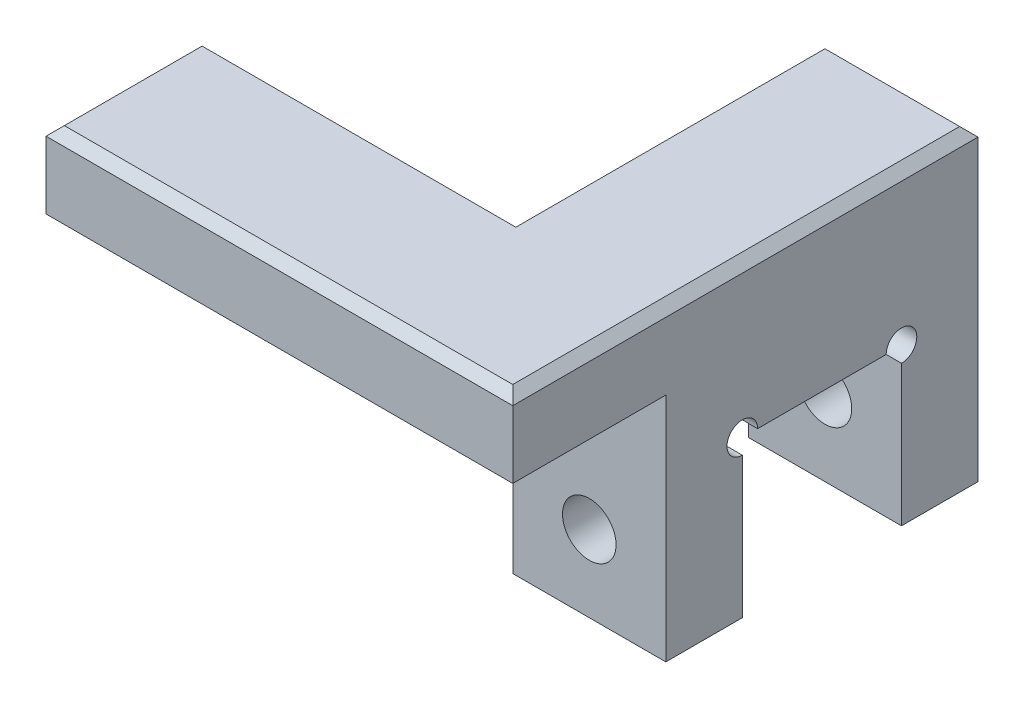
ISO-10303-21;
HEADER;
FILE_DESCRIPTION(('STEP AP214'),'2;1');
FILE_NAME('part.step','',(''),(''),'','','');
FILE_SCHEMA(('AUTOMOTIVE_DESIGN { 1 0 10303 214 1 1 1 1 }'));
ENDSEC;
DATA;
#1=APPLICATION_CONTEXT('core data for automotive mechanical design processes');
#2=APPLICATION_PROTOCOL_DEFINITION('international standard','automotive_design',2000,#1);
#3=PRODUCT_CONTEXT('',#1,'mechanical');
#4=PRODUCT('Part','Part','',(#3));
#5=PRODUCT_RELATED_PRODUCT_CATEGORY('part','',(#4));
#6=PRODUCT_DEFINITION_FORMATION('','',#4);
#7=PRODUCT_DEFINITION_CONTEXT('part definition',#1,'design');
#8=PRODUCT_DEFINITION('design','',#6,#7);
#9=PRODUCT_DEFINITION_SHAPE('','',#8);
#10=(LENGTH_UNIT() NAMED_UNIT(*) SI_UNIT(.MILLI.,.METRE.));
#11=(NAMED_UNIT(*) PLANE_ANGLE_UNIT() SI_UNIT($,.RADIAN.));
#12=(NAMED_UNIT(*) SI_UNIT($,.STERADIAN.) SOLID_ANGLE_UNIT());
#13=UNCERTAINTY_MEASURE_WITH_UNIT(LENGTH_MEASURE(1.E-05),#10,'distance_accuracy_value','');
#14=(GEOMETRIC_REPRESENTATION_CONTEXT(3) GLOBAL_UNCERTAINTY_ASSIGNED_CONTEXT((#13)) GLOBAL_UNIT_ASSIGNED_CONTEXT((#10,
#11,#12)) REPRESENTATION_CONTEXT('',''));
#15=CARTESIAN_POINT('',(0.,0.,0.));
#16=DIRECTION('',(0.,0.,1.));
#17=DIRECTION('',(1.,0.,0.));
#18=AXIS2_PLACEMENT_3D('',#15,#16,#17);
#19=CARTESIAN_POINT('',(10.,0.,10.2));
#20=DIRECTION('',(0.,0.,-1.));
#21=DIRECTION('',(0.,1.,0.));
#22=AXIS2_PLACEMENT_3D('',#19,#20,#21);
#23=PLANE('',#22);
#24=CARTESIAN_POINT('',(5.,-0.0999999999999989,10.2));
#25=DIRECTION('',(0.,0.,-1.));
#26=DIRECTION('',(0.,1.,0.));
#27=AXIS2_PLACEMENT_3D('',#24,#25,#26);
#28=CIRCLE('',#27,1.75);
#29=CARTESIAN_POINT('',(5.,1.65,10.2));
#30=VERTEX_POINT('',#29);
#31=EDGE_CURVE('E220',#30,#30,#28,.T.);
#32=ORIENTED_EDGE('',*,*,#31,.T.);
#33=EDGE_LOOP('',(#32));
#34=FACE_BOUND('',#33,.T.);
#35=DIRECTION('',(0.,-1.,0.));
#36=VECTOR('',#35,1.);
#37=CARTESIAN_POINT('',(0.,0.,10.2));
#38=LINE('',#37,#36);
#39=CARTESIAN_POINT('',(0.,10.,10.2));
#40=VERTEX_POINT('',#39);
#41=CARTESIAN_POINT('',(0.,-5.1,10.2));
#42=VERTEX_POINT('',#41);
#43=EDGE_CURVE('E215',#40,#42,#38,.T.);
#44=ORIENTED_EDGE('',*,*,#43,.T.);
#45=DIRECTION('',(-1.,0.,0.));
#46=VECTOR('',#45,1.);
#47=CARTESIAN_POINT('',(10.,-5.1,10.2));
#48=LINE('',#47,#46);
#49=CARTESIAN_POINT('',(10.,-5.1,10.2));
#50=VERTEX_POINT('',#49);
#51=EDGE_CURVE('E257',#50,#42,#48,.T.);
#52=ORIENTED_EDGE('',*,*,#51,.F.);
#53=DIRECTION('',(0.,-1.,0.));
#54=VECTOR('',#53,1.);
#55=CARTESIAN_POINT('',(10.,0.,10.2));
#56=LINE('',#55,#54);
#57=CARTESIAN_POINT('',(10.,10.,10.2));
#58=VERTEX_POINT('',#57);
#59=EDGE_CURVE('E242',#58,#50,#56,.T.);
#60=ORIENTED_EDGE('',*,*,#59,.F.);
#61=DIRECTION('',(-1.,0.,0.));
#62=VECTOR('',#61,1.);
#63=CARTESIAN_POINT('',(10.,10.,10.2));
#64=LINE('',#63,#62);
#65=EDGE_CURVE('E214',#58,#40,#64,.T.);
#66=ORIENTED_EDGE('',*,*,#65,.T.);
#67=EDGE_LOOP('',(#44,#52,#60,#66));
#68=FACE_BOUND('',#67,.T.);
#69=ADVANCED_FACE('F45',(#34,#68),#23,.F.);
#70=CARTESIAN_POINT('',(10.,-5.1,0.));
#71=DIRECTION('',(0.,1.,0.));
#72=DIRECTION('',(0.,0.,1.));
#73=AXIS2_PLACEMENT_3D('',#70,#71,#72);
#74=PLANE('',#73);
#75=DIRECTION('',(0.,0.,-1.));
#76=VECTOR('',#75,1.);
#77=CARTESIAN_POINT('',(0.,-5.1,0.));
#78=LINE('',#77,#76);
#79=CARTESIAN_POINT('',(0.,-5.1,5.2));
#80=VERTEX_POINT('',#79);
#81=EDGE_CURVE('E219',#42,#80,#78,.T.);
#82=ORIENTED_EDGE('',*,*,#81,.T.);
#83=DIRECTION('',(-1.,0.,0.));
#84=VECTOR('',#83,1.);
#85=CARTESIAN_POINT('',(10.,-5.1,5.2));
#86=LINE('',#85,#84);
#87=CARTESIAN_POINT('',(10.,-5.1,5.2));
#88=VERTEX_POINT('',#87);
#89=EDGE_CURVE('E253',#88,#80,#86,.T.);
#90=ORIENTED_EDGE('',*,*,#89,.F.);
#91=DIRECTION('',(0.,0.,-1.));
#92=VECTOR('',#91,1.);
#93=CARTESIAN_POINT('',(10.,-5.1,0.));
#94=LINE('',#93,#92);
#95=EDGE_CURVE('E205',#50,#88,#94,.T.);
#96=ORIENTED_EDGE('',*,*,#95,.F.);
#97=ORIENTED_EDGE('',*,*,#51,.T.);
#98=EDGE_LOOP('',(#82,#90,#96,#97));
#99=FACE_BOUND('',#98,.T.);
#100=ADVANCED_FACE('F394',(#99),#74,.F.);
#101=CARTESIAN_POINT('',(10.,0.,5.2));
#102=DIRECTION('',(0.,0.,1.));
#103=DIRECTION('',(1.,0.,0.));
#104=AXIS2_PLACEMENT_3D('',#101,#102,#103);
#105=PLANE('',#104);
#106=CARTESIAN_POINT('',(5.,-0.0999999999999989,5.2));
#107=DIRECTION('',(0.,0.,1.));
#108=DIRECTION('',(1.,0.,0.));
#109=AXIS2_PLACEMENT_3D('',#106,#107,#108);
#110=CIRCLE('',#109,1.75);
#111=CARTESIAN_POINT('',(6.75,-0.0999999999999989,5.2));
#112=VERTEX_POINT('',#111);
#113=EDGE_CURVE('E379',#112,#112,#110,.T.);
#114=ORIENTED_EDGE('',*,*,#113,.T.);
#115=EDGE_LOOP('',(#114));
#116=FACE_BOUND('',#115,.T.);
#117=DIRECTION('',(0.,1.,0.));
#118=VECTOR('',#117,1.);
#119=CARTESIAN_POINT('',(0.,0.,5.2));
#120=LINE('',#119,#118);
#121=CARTESIAN_POINT('',(0.,4.1,5.2));
#122=VERTEX_POINT('',#121);
#123=EDGE_CURVE('E223',#80,#122,#120,.T.);
#124=ORIENTED_EDGE('',*,*,#123,.T.);
#125=DIRECTION('',(-1.,0.,0.));
#126=VECTOR('',#125,1.);
#127=CARTESIAN_POINT('',(10.,4.1,5.2));
#128=LINE('',#127,#126);
#129=CARTESIAN_POINT('',(10.,4.1,5.2));
#130=VERTEX_POINT('',#129);
#131=EDGE_CURVE('E331',#122,#130,#128,.F.);
#132=ORIENTED_EDGE('',*,*,#131,.T.);
#133=DIRECTION('',(0.,1.,0.));
#134=VECTOR('',#133,1.);
#135=CARTESIAN_POINT('',(10.,0.,5.2));
#136=LINE('',#135,#134);
#137=EDGE_CURVE('E199',#88,#130,#136,.T.);
#138=ORIENTED_EDGE('',*,*,#137,.F.);
#139=ORIENTED_EDGE('',*,*,#89,.T.);
#140=EDGE_LOOP('',(#124,#132,#138,#139));
#141=FACE_BOUND('',#140,.T.);
#142=ADVANCED_FACE('F397',(#116,#141),#105,.F.);
#143=CARTESIAN_POINT('',(10.,5.1,0.));
#144=DIRECTION('',(0.,1.,0.));
#145=DIRECTION('',(0.,0.,1.));
#146=AXIS2_PLACEMENT_3D('',#143,#144,#145);
#147=PLANE('',#146);
#148=DIRECTION('',(0.,0.,-1.));
#149=VECTOR('',#148,1.);
#150=CARTESIAN_POINT('',(10.,5.1,0.));
#151=LINE('',#150,#149);
#152=CARTESIAN_POINT('',(10.,5.1,4.2));
#153=VERTEX_POINT('',#152);
#154=CARTESIAN_POINT('',(10.,5.1,-4.2));
#155=VERTEX_POINT('',#154);
#156=EDGE_CURVE('E188',#153,#155,#151,.T.);
#157=ORIENTED_EDGE('',*,*,#156,.F.);
#158=DIRECTION('',(-1.,0.,0.));
#159=VECTOR('',#158,1.);
#160=CARTESIAN_POINT('',(10.,5.1,4.2));
#161=LINE('',#160,#159);
#162=CARTESIAN_POINT('',(0.,5.1,4.2));
#163=VERTEX_POINT('',#162);
#164=EDGE_CURVE('E192',#153,#163,#161,.T.);
#165=ORIENTED_EDGE('',*,*,#164,.T.);
#166=DIRECTION('',(0.,0.,-1.));
#167=VECTOR('',#166,1.);
#168=CARTESIAN_POINT('',(0.,5.1,0.));
#169=LINE('',#168,#167);
#170=CARTESIAN_POINT('',(0.,5.1,-4.2));
#171=VERTEX_POINT('',#170);
#172=EDGE_CURVE('E190',#163,#171,#169,.T.);
#173=ORIENTED_EDGE('',*,*,#172,.T.);
#174=DIRECTION('',(-1.,0.,0.));
#175=VECTOR('',#174,1.);
#176=CARTESIAN_POINT('',(10.,5.1,-4.2));
#177=LINE('',#176,#175);
#178=EDGE_CURVE('E171',#171,#155,#177,.F.);
#179=ORIENTED_EDGE('',*,*,#178,.T.);
#180=EDGE_LOOP('',(#157,#165,#173,#179));
#181=FACE_BOUND('',#180,.T.);
#182=ADVANCED_FACE('F186',(#181),#147,.F.);
#183=CARTESIAN_POINT('',(10.,0.,-5.2));
#184=DIRECTION('',(0.,0.,1.));
#185=DIRECTION('',(1.,0.,0.));
#186=AXIS2_PLACEMENT_3D('',#183,#184,#185);
#187=PLANE('',#186);
#188=DIRECTION('',(-1.,0.,0.));
#189=VECTOR('',#188,1.);
#190=CARTESIAN_POINT('',(10.,4.1,-5.2));
#191=LINE('',#190,#189);
#192=CARTESIAN_POINT('',(0.,4.1,-5.2));
#193=VERTEX_POINT('',#192);
#194=CARTESIAN_POINT('',(10.,4.1,-5.2));
#195=VERTEX_POINT('',#194);
#196=EDGE_CURVE('E174',#193,#195,#191,.F.);
#197=ORIENTED_EDGE('',*,*,#196,.F.);
#198=DIRECTION('',(0.,1.,0.));
#199=VECTOR('',#198,1.);
#200=CARTESIAN_POINT('',(0.,0.,-5.2));
#201=LINE('',#200,#199);
#202=CARTESIAN_POINT('',(0.,-5.1,-5.2));
#203=VERTEX_POINT('',#202);
#204=EDGE_CURVE('E229',#203,#193,#201,.T.);
#205=ORIENTED_EDGE('',*,*,#204,.F.);
#206=DIRECTION('',(-1.,0.,0.));
#207=VECTOR('',#206,1.);
#208=CARTESIAN_POINT('',(10.,-5.1,-5.2));
#209=LINE('',#208,#207);
#210=CARTESIAN_POINT('',(10.,-5.1,-5.2));
#211=VERTEX_POINT('',#210);
#212=EDGE_CURVE('E250',#211,#203,#209,.T.);
#213=ORIENTED_EDGE('',*,*,#212,.F.);
#214=DIRECTION('',(0.,1.,0.));
#215=VECTOR('',#214,1.);
#216=CARTESIAN_POINT('',(10.,0.,-5.2));
#217=LINE('',#216,#215);
#218=EDGE_CURVE('E198',#211,#195,#217,.T.);
#219=ORIENTED_EDGE('',*,*,#218,.T.);
#220=EDGE_LOOP('',(#197,#205,#213,#219));
#221=FACE_BOUND('',#220,.T.);
#222=CARTESIAN_POINT('',(5.,-0.0999999999999989,-5.2));
#223=DIRECTION('',(0.,0.,1.));
#224=DIRECTION('',(1.,0.,0.));
#225=AXIS2_PLACEMENT_3D('',#222,#223,#224);
#226=CIRCLE('',#225,1.75);
#227=CARTESIAN_POINT('',(6.75,-0.0999999999999989,-5.2));
#228=VERTEX_POINT('',#227);
#229=EDGE_CURVE('E375',#228,#228,#226,.T.);
#230=ORIENTED_EDGE('',*,*,#229,.F.);
#231=EDGE_LOOP('',(#230));
#232=FACE_BOUND('',#231,.T.);
#233=ADVANCED_FACE('F404',(#221,#232),#187,.T.);
#234=CARTESIAN_POINT('',(10.,-5.1,0.));
#235=DIRECTION('',(0.,1.,0.));
#236=DIRECTION('',(0.,0.,1.));
#237=AXIS2_PLACEMENT_3D('',#234,#235,#236);
#238=PLANE('',#237);
#239=DIRECTION('',(0.,0.,-1.));
#240=VECTOR('',#239,1.);
#241=CARTESIAN_POINT('',(0.,-5.1,0.));
#242=LINE('',#241,#240);
#243=CARTESIAN_POINT('',(0.,-5.1,-10.2));
#244=VERTEX_POINT('',#243);
#245=EDGE_CURVE('E233',#203,#244,#242,.T.);
#246=ORIENTED_EDGE('',*,*,#245,.T.);
#247=DIRECTION('',(-1.,0.,0.));
#248=VECTOR('',#247,1.);
#249=CARTESIAN_POINT('',(10.,-5.1,-10.2));
#250=LINE('',#249,#248);
#251=CARTESIAN_POINT('',(10.,-5.1,-10.2));
#252=VERTEX_POINT('',#251);
#253=EDGE_CURVE('E246',#252,#244,#250,.T.);
#254=ORIENTED_EDGE('',*,*,#253,.F.);
#255=DIRECTION('',(0.,0.,-1.));
#256=VECTOR('',#255,1.);
#257=CARTESIAN_POINT('',(10.,-5.1,0.));
#258=LINE('',#257,#256);
#259=EDGE_CURVE('E203',#211,#252,#258,.T.);
#260=ORIENTED_EDGE('',*,*,#259,.F.);
#261=ORIENTED_EDGE('',*,*,#212,.T.);
#262=EDGE_LOOP('',(#246,#254,#260,#261));
#263=FACE_BOUND('',#262,.T.);
#264=ADVANCED_FACE('F410',(#263),#238,.F.);
#265=CARTESIAN_POINT('',(10.,0.,-10.2));
#266=DIRECTION('',(0.,0.,1.));
#267=DIRECTION('',(1.,0.,0.));
#268=AXIS2_PLACEMENT_3D('',#265,#266,#267);
#269=PLANE('',#268);
#270=CARTESIAN_POINT('',(5.,-0.0999999999999989,-10.2));
#271=DIRECTION('',(0.,0.,1.));
#272=DIRECTION('',(1.,0.,0.));
#273=AXIS2_PLACEMENT_3D('',#270,#271,#272);
#274=CIRCLE('',#273,1.75);
#275=CARTESIAN_POINT('',(6.75,-0.0999999999999989,-10.2));
#276=VERTEX_POINT('',#275);
#277=EDGE_CURVE('E371',#276,#276,#274,.T.);
#278=ORIENTED_EDGE('',*,*,#277,.T.);
#279=EDGE_LOOP('',(#278));
#280=FACE_BOUND('',#279,.T.);
#281=DIRECTION('',(0.,1.,0.));
#282=VECTOR('',#281,1.);
#283=CARTESIAN_POINT('',(0.,0.,-10.2));
#284=LINE('',#283,#282);
#285=CARTESIAN_POINT('',(0.,14.4,-10.2));
#286=VERTEX_POINT('',#285);
#287=EDGE_CURVE('E236',#244,#286,#284,.T.);
#288=ORIENTED_EDGE('',*,*,#287,.T.);
#289=DIRECTION('',(1.,0.,0.));
#290=VECTOR('',#289,1.);
#291=CARTESIAN_POINT('',(10.,14.4,-10.2));
#292=LINE('',#291,#290);
#293=CARTESIAN_POINT('',(10.,14.4,-10.2));
#294=VERTEX_POINT('',#293);
#295=EDGE_CURVE('E56',#286,#294,#292,.T.);
#296=ORIENTED_EDGE('',*,*,#295,.T.);
#297=DIRECTION('',(0.,1.,0.));
#298=VECTOR('',#297,1.);
#299=CARTESIAN_POINT('',(10.,0.,-10.2));
#300=LINE('',#299,#298);
#301=EDGE_CURVE('E211',#252,#294,#300,.T.);
#302=ORIENTED_EDGE('',*,*,#301,.F.);
#303=ORIENTED_EDGE('',*,*,#253,.T.);
#304=EDGE_LOOP('',(#288,#296,#302,#303));
#305=FACE_BOUND('',#304,.T.);
#306=ADVANCED_FACE('F411',(#280,#305),#269,.F.);
#307=CARTESIAN_POINT('',(10.,0.,0.));
#308=DIRECTION('',(1.,0.,0.));
#309=DIRECTION('',(0.,0.,-1.));
#310=AXIS2_PLACEMENT_3D('',#307,#308,#309);
#311=PLANE('',#310);
#312=ORIENTED_EDGE('',*,*,#301,.T.);
#313=DIRECTION('',(0.,0.,1.));
#314=VECTOR('',#313,1.);
#315=CARTESIAN_POINT('',(10.,14.4,20.2));
#316=LINE('',#315,#314);
#317=CARTESIAN_POINT('',(10.,14.4,20.2));
#318=VERTEX_POINT('',#317);
#319=EDGE_CURVE('E11',#294,#318,#316,.T.);
#320=ORIENTED_EDGE('',*,*,#319,.T.);
#321=DIRECTION('',(0.,-1.,0.));
#322=VECTOR('',#321,1.);
#323=CARTESIAN_POINT('',(10.,15.,20.2));
#324=LINE('',#323,#322);
#325=CARTESIAN_POINT('',(10.,9.99999999999999,20.2));
#326=VERTEX_POINT('',#325);
#327=EDGE_CURVE('E359',#318,#326,#324,.T.);
#328=ORIENTED_EDGE('',*,*,#327,.T.);
#329=DIRECTION('',(0.,0.,-1.));
#330=VECTOR('',#329,1.);
#331=CARTESIAN_POINT('',(10.,10.,10.2));
#332=LINE('',#331,#330);
#333=EDGE_CURVE('E355',#326,#58,#332,.T.);
#334=ORIENTED_EDGE('',*,*,#333,.T.);
#335=ORIENTED_EDGE('',*,*,#59,.T.);
#336=ORIENTED_EDGE('',*,*,#95,.T.);
#337=ORIENTED_EDGE('',*,*,#137,.T.);
#338=CARTESIAN_POINT('',(10.,5.1,5.2));
#339=DIRECTION('',(-1.,0.,0.));
#340=DIRECTION('',(0.,0.,1.));
#341=AXIS2_PLACEMENT_3D('',#338,#339,#340);
#342=CIRCLE('',#341,1.);
#343=EDGE_CURVE('E180',#130,#153,#342,.T.);
#344=ORIENTED_EDGE('',*,*,#343,.T.);
#345=ORIENTED_EDGE('',*,*,#156,.T.);
#346=CARTESIAN_POINT('',(10.,5.1,-5.2));
#347=DIRECTION('',(-1.,0.,0.));
#348=DIRECTION('',(0.,0.,1.));
#349=AXIS2_PLACEMENT_3D('',#346,#347,#348);
#350=CIRCLE('',#349,1.);
#351=EDGE_CURVE('E168',#155,#195,#350,.T.);
#352=ORIENTED_EDGE('',*,*,#351,.T.);
#353=ORIENTED_EDGE('',*,*,#218,.F.);
#354=ORIENTED_EDGE('',*,*,#259,.T.);
#355=EDGE_LOOP('',(#312,#320,#328,#334,#335,#336,#337,#344,#345,#352,#353,#354));
#356=FACE_BOUND('',#355,.T.);
#357=ADVANCED_FACE('F195',(#356),#311,.T.);
#358=CARTESIAN_POINT('',(0.,0.,0.));
#359=DIRECTION('',(1.,0.,0.));
#360=DIRECTION('',(0.,0.,-1.));
#361=AXIS2_PLACEMENT_3D('',#358,#359,#360);
#362=PLANE('',#361);
#363=DIRECTION('',(0.,-1.,0.));
#364=VECTOR('',#363,1.);
#365=CARTESIAN_POINT('',(0.,15.,10.));
#366=LINE('',#365,#364);
#367=CARTESIAN_POINT('',(0.,14.4,10.));
#368=VERTEX_POINT('',#367);
#369=CARTESIAN_POINT('',(0.,10.,10.));
#370=VERTEX_POINT('',#369);
#371=EDGE_CURVE('E368',#368,#370,#366,.T.);
#372=ORIENTED_EDGE('',*,*,#371,.F.);
#373=DIRECTION('',(0.,0.,-1.));
#374=VECTOR('',#373,1.);
#375=CARTESIAN_POINT('',(0.,14.4,0.));
#376=LINE('',#375,#374);
#377=EDGE_CURVE('E71',#368,#286,#376,.T.);
#378=ORIENTED_EDGE('',*,*,#377,.T.);
#379=ORIENTED_EDGE('',*,*,#287,.F.);
#380=ORIENTED_EDGE('',*,*,#245,.F.);
#381=ORIENTED_EDGE('',*,*,#204,.T.);
#382=CARTESIAN_POINT('',(0.,5.1,-5.2));
#383=DIRECTION('',(-1.,0.,0.));
#384=DIRECTION('',(0.,0.,1.));
#385=AXIS2_PLACEMENT_3D('',#382,#383,#384);
#386=CIRCLE('',#385,1.);
#387=EDGE_CURVE('E181',#171,#193,#386,.T.);
#388=ORIENTED_EDGE('',*,*,#387,.F.);
#389=ORIENTED_EDGE('',*,*,#172,.F.);
#390=CARTESIAN_POINT('',(0.,5.1,5.2));
#391=DIRECTION('',(1.,0.,0.));
#392=DIRECTION('',(0.,0.,-1.));
#393=AXIS2_PLACEMENT_3D('',#390,#391,#392);
#394=CIRCLE('',#393,1.);
#395=EDGE_CURVE('E261',#163,#122,#394,.T.);
#396=ORIENTED_EDGE('',*,*,#395,.T.);
#397=ORIENTED_EDGE('',*,*,#123,.F.);
#398=ORIENTED_EDGE('',*,*,#81,.F.);
#399=ORIENTED_EDGE('',*,*,#43,.F.);
#400=DIRECTION('',(0.,0.,1.));
#401=VECTOR('',#400,1.);
#402=CARTESIAN_POINT('',(0.,10.,0.));
#403=LINE('',#402,#401);
#404=EDGE_CURVE('E239',#370,#40,#403,.T.);
#405=ORIENTED_EDGE('',*,*,#404,.F.);
#406=EDGE_LOOP('',(#372,#378,#379,#380,#381,#388,#389,#396,#397,#398,#399,#405));
#407=FACE_BOUND('',#406,.T.);
#408=ADVANCED_FACE('F400',(#407),#362,.F.);
#409=CARTESIAN_POINT('',(5.,-0.0999999999999989,-10.2));
#410=DIRECTION('',(0.,0.,1.));
#411=DIRECTION('',(1.,0.,0.));
#412=AXIS2_PLACEMENT_3D('',#409,#410,#411);
#413=CYLINDRICAL_SURFACE('',#412,1.75);
#414=ORIENTED_EDGE('',*,*,#229,.T.);
#415=EDGE_LOOP('',(#414));
#416=FACE_BOUND('',#415,.T.);
#417=ORIENTED_EDGE('',*,*,#277,.F.);
#418=EDGE_LOOP('',(#417));
#419=FACE_BOUND('',#418,.T.);
#420=ADVANCED_FACE('F515',(#416,#419),#413,.F.);
#421=ORIENTED_EDGE('',*,*,#113,.F.);
#422=EDGE_LOOP('',(#421));
#423=FACE_BOUND('',#422,.T.);
#424=ORIENTED_EDGE('',*,*,#31,.F.);
#425=EDGE_LOOP('',(#424));
#426=FACE_BOUND('',#425,.T.);
#427=ADVANCED_FACE('F514',(#423,#426),#413,.F.);
#428=CARTESIAN_POINT('',(-20.5,15.,10.));
#429=DIRECTION('',(0.,0.,1.));
#430=DIRECTION('',(0.,-1.,0.));
#431=AXIS2_PLACEMENT_3D('',#428,#429,#430);
#432=PLANE('',#431);
#433=DIRECTION('',(0.,-1.,0.));
#434=VECTOR('',#433,1.);
#435=CARTESIAN_POINT('',(-20.5,15.,10.));
#436=LINE('',#435,#434);
#437=CARTESIAN_POINT('',(-20.5,14.4,10.));
#438=VERTEX_POINT('',#437);
#439=CARTESIAN_POINT('',(-20.5,10.,10.));
#440=VERTEX_POINT('',#439);
#441=EDGE_CURVE('E365',#438,#440,#436,.T.);
#442=ORIENTED_EDGE('',*,*,#441,.F.);
#443=DIRECTION('',(1.,0.,0.));
#444=VECTOR('',#443,1.);
#445=CARTESIAN_POINT('',(-20.5,14.4,10.));
#446=LINE('',#445,#444);
#447=EDGE_CURVE('E291',#438,#368,#446,.T.);
#448=ORIENTED_EDGE('',*,*,#447,.T.);
#449=ORIENTED_EDGE('',*,*,#371,.T.);
#450=DIRECTION('',(-1.,0.,0.));
#451=VECTOR('',#450,1.);
#452=CARTESIAN_POINT('',(-20.5,10.,10.));
#453=LINE('',#452,#451);
#454=EDGE_CURVE('E340',#370,#440,#453,.T.);
#455=ORIENTED_EDGE('',*,*,#454,.T.);
#456=EDGE_LOOP('',(#442,#448,#449,#455));
#457=FACE_BOUND('',#456,.T.);
#458=ADVANCED_FACE('F491',(#457),#432,.F.);
#459=CARTESIAN_POINT('',(-20.5,15.,20.2));
#460=DIRECTION('',(1.,0.,0.));
#461=DIRECTION('',(0.,0.,-1.));
#462=AXIS2_PLACEMENT_3D('',#459,#460,#461);
#463=PLANE('',#462);
#464=DIRECTION('',(0.,-1.,0.));
#465=VECTOR('',#464,1.);
#466=CARTESIAN_POINT('',(-20.5,15.,20.2));
#467=LINE('',#466,#465);
#468=CARTESIAN_POINT('',(-20.5,14.4,20.2));
#469=VERTEX_POINT('',#468);
#470=CARTESIAN_POINT('',(-20.5,9.99999999999999,20.2));
#471=VERTEX_POINT('',#470);
#472=EDGE_CURVE('E362',#469,#471,#467,.T.);
#473=ORIENTED_EDGE('',*,*,#472,.F.);
#474=DIRECTION('',(0.,0.,-1.));
#475=VECTOR('',#474,1.);
#476=CARTESIAN_POINT('',(-20.5,14.4,20.2));
#477=LINE('',#476,#475);
#478=EDGE_CURVE('E288',#469,#438,#477,.T.);
#479=ORIENTED_EDGE('',*,*,#478,.T.);
#480=ORIENTED_EDGE('',*,*,#441,.T.);
#481=DIRECTION('',(0.,0.,1.));
#482=VECTOR('',#481,1.);
#483=CARTESIAN_POINT('',(-20.5,9.99999999999999,20.2));
#484=LINE('',#483,#482);
#485=EDGE_CURVE('E347',#440,#471,#484,.T.);
#486=ORIENTED_EDGE('',*,*,#485,.T.);
#487=EDGE_LOOP('',(#473,#479,#480,#486));
#488=FACE_BOUND('',#487,.T.);
#489=ADVANCED_FACE('F489',(#488),#463,.F.);
#490=CARTESIAN_POINT('',(10.,15.,20.2));
#491=DIRECTION('',(0.,0.,-1.));
#492=DIRECTION('',(0.,1.,0.));
#493=AXIS2_PLACEMENT_3D('',#490,#491,#492);
#494=PLANE('',#493);
#495=ORIENTED_EDGE('',*,*,#327,.F.);
#496=DIRECTION('',(-1.,0.,0.));
#497=VECTOR('',#496,1.);
#498=CARTESIAN_POINT('',(10.,14.4,20.2));
#499=LINE('',#498,#497);
#500=EDGE_CURVE('E284',#318,#469,#499,.T.);
#501=ORIENTED_EDGE('',*,*,#500,.T.);
#502=ORIENTED_EDGE('',*,*,#472,.T.);
#503=DIRECTION('',(1.,0.,0.));
#504=VECTOR('',#503,1.);
#505=CARTESIAN_POINT('',(10.,9.99999999999999,20.2));
#506=LINE('',#505,#504);
#507=EDGE_CURVE('E351',#471,#326,#506,.T.);
#508=ORIENTED_EDGE('',*,*,#507,.T.);
#509=EDGE_LOOP('',(#495,#501,#502,#508));
#510=FACE_BOUND('',#509,.T.);
#511=ADVANCED_FACE('F478',(#510),#494,.F.);
#512=CARTESIAN_POINT('',(0.,15.,0.));
#513=DIRECTION('',(0.,-1.,0.));
#514=DIRECTION('',(0.,0.,-1.));
#515=AXIS2_PLACEMENT_3D('',#512,#513,#514);
#516=PLANE('',#515);
#517=DIRECTION('',(0.,0.,1.));
#518=VECTOR('',#517,1.);
#519=CARTESIAN_POINT('',(-19.9,15.,0.));
#520=LINE('',#519,#518);
#521=CARTESIAN_POINT('',(-19.9,15.,10.6));
#522=VERTEX_POINT('',#521);
#523=CARTESIAN_POINT('',(-19.9,15.,19.6));
#524=VERTEX_POINT('',#523);
#525=EDGE_CURVE('E277',#522,#524,#520,.T.);
#526=ORIENTED_EDGE('',*,*,#525,.T.);
#527=DIRECTION('',(1.,0.,0.));
#528=VECTOR('',#527,1.);
#529=CARTESIAN_POINT('',(0.,15.,19.6));
#530=LINE('',#529,#528);
#531=CARTESIAN_POINT('',(9.4,15.,19.6));
#532=VERTEX_POINT('',#531);
#533=EDGE_CURVE('E280',#524,#532,#530,.T.);
#534=ORIENTED_EDGE('',*,*,#533,.T.);
#535=DIRECTION('',(0.,0.,-1.));
#536=VECTOR('',#535,1.);
#537=CARTESIAN_POINT('',(9.4,15.,-10.2));
#538=LINE('',#537,#536);
#539=CARTESIAN_POINT('',(9.4,15.,-9.6));
#540=VERTEX_POINT('',#539);
#541=EDGE_CURVE('E265',#532,#540,#538,.T.);
#542=ORIENTED_EDGE('',*,*,#541,.T.);
#543=DIRECTION('',(-1.,0.,0.));
#544=VECTOR('',#543,1.);
#545=CARTESIAN_POINT('',(0.,15.,-9.6));
#546=LINE('',#545,#544);
#547=CARTESIAN_POINT('',(0.599999999999996,15.,-9.6));
#548=VERTEX_POINT('',#547);
#549=EDGE_CURVE('E268',#540,#548,#546,.T.);
#550=ORIENTED_EDGE('',*,*,#549,.T.);
#551=DIRECTION('',(0.,0.,1.));
#552=VECTOR('',#551,1.);
#553=CARTESIAN_POINT('',(0.599999999999996,15.,0.));
#554=LINE('',#553,#552);
#555=CARTESIAN_POINT('',(0.599999999999996,15.,10.6));
#556=VERTEX_POINT('',#555);
#557=EDGE_CURVE('E271',#548,#556,#554,.T.);
#558=ORIENTED_EDGE('',*,*,#557,.T.);
#559=DIRECTION('',(-1.,0.,0.));
#560=VECTOR('',#559,1.);
#561=CARTESIAN_POINT('',(0.,15.,10.6));
#562=LINE('',#561,#560);
#563=EDGE_CURVE('E274',#556,#522,#562,.T.);
#564=ORIENTED_EDGE('',*,*,#563,.T.);
#565=EDGE_LOOP('',(#526,#534,#542,#550,#558,#564));
#566=FACE_BOUND('',#565,.T.);
#567=ADVANCED_FACE('F495',(#566),#516,.F.);
#568=CARTESIAN_POINT('',(0.,10.,0.));
#569=DIRECTION('',(0.,-1.,0.));
#570=DIRECTION('',(0.,0.,-1.));
#571=AXIS2_PLACEMENT_3D('',#568,#569,#570);
#572=PLANE('',#571);
#573=CARTESIAN_POINT('',(-10.25,10.,15.1));
#574=DIRECTION('',(0.,-1.,0.));
#575=DIRECTION('',(0.,0.,-1.));
#576=AXIS2_PLACEMENT_3D('',#573,#574,#575);
#577=CIRCLE('',#576,3.2);
#578=CARTESIAN_POINT('',(-10.25,10.,11.9));
#579=VERTEX_POINT('',#578);
#580=EDGE_CURVE('E335',#579,#579,#577,.T.);
#581=ORIENTED_EDGE('',*,*,#580,.F.);
#582=EDGE_LOOP('',(#581));
#583=FACE_BOUND('',#582,.T.);
#584=ORIENTED_EDGE('',*,*,#454,.F.);
#585=ORIENTED_EDGE('',*,*,#404,.T.);
#586=ORIENTED_EDGE('',*,*,#65,.F.);
#587=ORIENTED_EDGE('',*,*,#333,.F.);
#588=ORIENTED_EDGE('',*,*,#507,.F.);
#589=ORIENTED_EDGE('',*,*,#485,.F.);
#590=EDGE_LOOP('',(#584,#585,#586,#587,#588,#589));
#591=FACE_BOUND('',#590,.T.);
#592=ADVANCED_FACE('F497',(#583,#591),#572,.T.);
#593=CARTESIAN_POINT('',(-10.25,12.6,15.1));
#594=DIRECTION('',(0.,-1.,0.));
#595=DIRECTION('',(0.,0.,-1.));
#596=AXIS2_PLACEMENT_3D('',#593,#594,#595);
#597=CYLINDRICAL_SURFACE('',#596,3.2);
#598=CARTESIAN_POINT('',(-10.25,12.6,15.1));
#599=DIRECTION('',(0.,-1.,0.));
#600=DIRECTION('',(0.,0.,-1.));
#601=AXIS2_PLACEMENT_3D('',#598,#599,#600);
#602=CIRCLE('',#601,3.2);
#603=CARTESIAN_POINT('',(-10.25,12.6,11.9));
#604=VERTEX_POINT('',#603);
#605=EDGE_CURVE('E336',#604,#604,#602,.T.);
#606=ORIENTED_EDGE('',*,*,#605,.F.);
#607=EDGE_LOOP('',(#606));
#608=FACE_BOUND('',#607,.T.);
#609=ORIENTED_EDGE('',*,*,#580,.T.);
#610=EDGE_LOOP('',(#609));
#611=FACE_BOUND('',#610,.T.);
#612=ADVANCED_FACE('F503',(#608,#611),#597,.F.);
#613=CARTESIAN_POINT('',(-10.25,12.6,15.1));
#614=DIRECTION('',(0.,-1.,0.));
#615=DIRECTION('',(0.,0.,-1.));
#616=AXIS2_PLACEMENT_3D('',#613,#614,#615);
#617=PLANE('',#616);
#618=ORIENTED_EDGE('',*,*,#605,.T.);
#619=EDGE_LOOP('',(#618));
#620=FACE_BOUND('',#619,.T.);
#621=ADVANCED_FACE('F598',(#620),#617,.T.);
#622=CARTESIAN_POINT('',(10.,5.1,-5.2));
#623=DIRECTION('',(-1.,0.,0.));
#624=DIRECTION('',(0.,0.,1.));
#625=AXIS2_PLACEMENT_3D('',#622,#623,#624);
#626=CYLINDRICAL_SURFACE('',#625,1.);
#627=ORIENTED_EDGE('',*,*,#387,.T.);
#628=ORIENTED_EDGE('',*,*,#196,.T.);
#629=ORIENTED_EDGE('',*,*,#351,.F.);
#630=ORIENTED_EDGE('',*,*,#178,.F.);
#631=EDGE_LOOP('',(#627,#628,#629,#630));
#632=FACE_BOUND('',#631,.T.);
#633=ADVANCED_FACE('F170',(#632),#626,.F.);
#634=CARTESIAN_POINT('',(10.,5.1,5.2));
#635=DIRECTION('',(-1.,0.,0.));
#636=DIRECTION('',(0.,0.,1.));
#637=AXIS2_PLACEMENT_3D('',#634,#635,#636);
#638=CYLINDRICAL_SURFACE('',#637,1.);
#639=ORIENTED_EDGE('',*,*,#395,.F.);
#640=ORIENTED_EDGE('',*,*,#164,.F.);
#641=ORIENTED_EDGE('',*,*,#343,.F.);
#642=ORIENTED_EDGE('',*,*,#131,.F.);
#643=EDGE_LOOP('',(#639,#640,#641,#642));
#644=FACE_BOUND('',#643,.T.);
#645=ADVANCED_FACE('F399',(#644),#638,.F.);
#646=CARTESIAN_POINT('',(0.599999999999996,15.,0.));
#647=DIRECTION('',(0.707106781186552,-0.707106781186543,0.));
#648=DIRECTION('',(0.,0.,1.));
#649=AXIS2_PLACEMENT_3D('',#646,#647,#648);
#650=PLANE('',#649);
#651=DIRECTION('',(0.577350269189624,0.57735026918963,0.577350269189624));
#652=VECTOR('',#651,1.);
#653=CARTESIAN_POINT('',(0.399999999999999,14.8,-9.8));
#654=LINE('',#653,#652);
#655=EDGE_CURVE('E311',#286,#548,#654,.T.);
#656=ORIENTED_EDGE('',*,*,#655,.F.);
#657=ORIENTED_EDGE('',*,*,#377,.F.);
#658=DIRECTION('',(0.577350269189624,0.57735026918963,0.577350269189624));
#659=VECTOR('',#658,1.);
#660=CARTESIAN_POINT('',(0.399999999999999,14.8,10.4));
#661=LINE('',#660,#659);
#662=EDGE_CURVE('E50',#556,#368,#661,.F.);
#663=ORIENTED_EDGE('',*,*,#662,.F.);
#664=ORIENTED_EDGE('',*,*,#557,.F.);
#665=EDGE_LOOP('',(#656,#657,#663,#664));
#666=FACE_BOUND('',#665,.T.);
#667=ADVANCED_FACE('F48',(#666),#650,.F.);
#668=CARTESIAN_POINT('',(0.,15.,10.6));
#669=DIRECTION('',(0.,-0.707106781186543,0.707106781186552));
#670=DIRECTION('',(-1.,0.,0.));
#671=AXIS2_PLACEMENT_3D('',#668,#669,#670);
#672=PLANE('',#671);
#673=ORIENTED_EDGE('',*,*,#662,.T.);
#674=ORIENTED_EDGE('',*,*,#447,.F.);
#675=DIRECTION('',(0.577350269189624,0.57735026918963,0.577350269189624));
#676=VECTOR('',#675,1.);
#677=CARTESIAN_POINT('',(-13.2666666666667,21.6333333333334,17.2333333333333));
#678=LINE('',#677,#676);
#679=EDGE_CURVE('E308',#522,#438,#678,.F.);
#680=ORIENTED_EDGE('',*,*,#679,.F.);
#681=ORIENTED_EDGE('',*,*,#563,.F.);
#682=EDGE_LOOP('',(#673,#674,#680,#681));
#683=FACE_BOUND('',#682,.T.);
#684=ADVANCED_FACE('F459',(#683),#672,.F.);
#685=CARTESIAN_POINT('',(0.,15.,-9.6));
#686=DIRECTION('',(0.,-0.707106781186543,0.707106781186552));
#687=DIRECTION('',(-1.,0.,0.));
#688=AXIS2_PLACEMENT_3D('',#685,#686,#687);
#689=PLANE('',#688);
#690=ORIENTED_EDGE('',*,*,#655,.T.);
#691=ORIENTED_EDGE('',*,*,#549,.F.);
#692=DIRECTION('',(0.577350269189624,-0.57735026918963,-0.577350269189624));
#693=VECTOR('',#692,1.);
#694=CARTESIAN_POINT('',(6.20000000000003,18.2,-6.40000000000003));
#695=LINE('',#694,#693);
#696=EDGE_CURVE('E304',#294,#540,#695,.F.);
#697=ORIENTED_EDGE('',*,*,#696,.F.);
#698=ORIENTED_EDGE('',*,*,#295,.F.);
#699=EDGE_LOOP('',(#690,#691,#697,#698));
#700=FACE_BOUND('',#699,.T.);
#701=ADVANCED_FACE('F453',(#700),#689,.F.);
#702=CARTESIAN_POINT('',(-19.9,15.,0.));
#703=DIRECTION('',(0.707106781186552,-0.707106781186544,0.));
#704=DIRECTION('',(0.,0.,1.));
#705=AXIS2_PLACEMENT_3D('',#702,#703,#704);
#706=PLANE('',#705);
#707=ORIENTED_EDGE('',*,*,#679,.T.);
#708=ORIENTED_EDGE('',*,*,#478,.F.);
#709=DIRECTION('',(0.577350269189622,0.577350269189629,-0.577350269189626));
#710=VECTOR('',#709,1.);
#711=CARTESIAN_POINT('',(-13.3666666666667,21.5333333333334,13.0666666666666));
#712=LINE('',#711,#710);
#713=EDGE_CURVE('E301',#524,#469,#712,.F.);
#714=ORIENTED_EDGE('',*,*,#713,.F.);
#715=ORIENTED_EDGE('',*,*,#525,.F.);
#716=EDGE_LOOP('',(#707,#708,#714,#715));
#717=FACE_BOUND('',#716,.T.);
#718=ADVANCED_FACE('F446',(#717),#706,.F.);
#719=CARTESIAN_POINT('',(9.4,15.,0.));
#720=DIRECTION('',(0.707106781186552,0.707106781186543,0.));
#721=DIRECTION('',(0.,0.,1.));
#722=AXIS2_PLACEMENT_3D('',#719,#720,#721);
#723=PLANE('',#722);
#724=ORIENTED_EDGE('',*,*,#696,.T.);
#725=ORIENTED_EDGE('',*,*,#541,.F.);
#726=DIRECTION('',(-0.577350269189622,0.577350269189629,-0.577350269189626));
#727=VECTOR('',#726,1.);
#728=CARTESIAN_POINT('',(2.86666666666671,21.5333333333334,13.0666666666667));
#729=LINE('',#728,#727);
#730=EDGE_CURVE('E298',#318,#532,#729,.T.);
#731=ORIENTED_EDGE('',*,*,#730,.F.);
#732=ORIENTED_EDGE('',*,*,#319,.F.);
#733=EDGE_LOOP('',(#724,#725,#731,#732));
#734=FACE_BOUND('',#733,.T.);
#735=ADVANCED_FACE('F439',(#734),#723,.T.);
#736=CARTESIAN_POINT('',(0.,15.,19.6));
#737=DIRECTION('',(0.,-0.707106781186546,-0.707106781186549));
#738=DIRECTION('',(1.,0.,0.));
#739=AXIS2_PLACEMENT_3D('',#736,#737,#738);
#740=PLANE('',#739);
#741=ORIENTED_EDGE('',*,*,#713,.T.);
#742=ORIENTED_EDGE('',*,*,#500,.F.);
#743=ORIENTED_EDGE('',*,*,#730,.T.);
#744=ORIENTED_EDGE('',*,*,#533,.F.);
#745=EDGE_LOOP('',(#741,#742,#743,#744));
#746=FACE_BOUND('',#745,.T.);
#747=ADVANCED_FACE('F433',(#746),#740,.F.);
#748=CLOSED_SHELL('',(#69,#100,#142,#182,#233,#264,#306,#357,#408,#420,#427,#458,#489,#511,#567,
#592,#612,#621,#633,#645,#667,#684,#701,#718,#735,#747));
#749=MANIFOLD_SOLID_BREP('B2',#748);
#750=ADVANCED_BREP_SHAPE_REPRESENTATION('',(#18,#749),#14);
#751=SHAPE_DEFINITION_REPRESENTATION(#9,#750);
ENDSEC;
END-ISO-10303-21;
